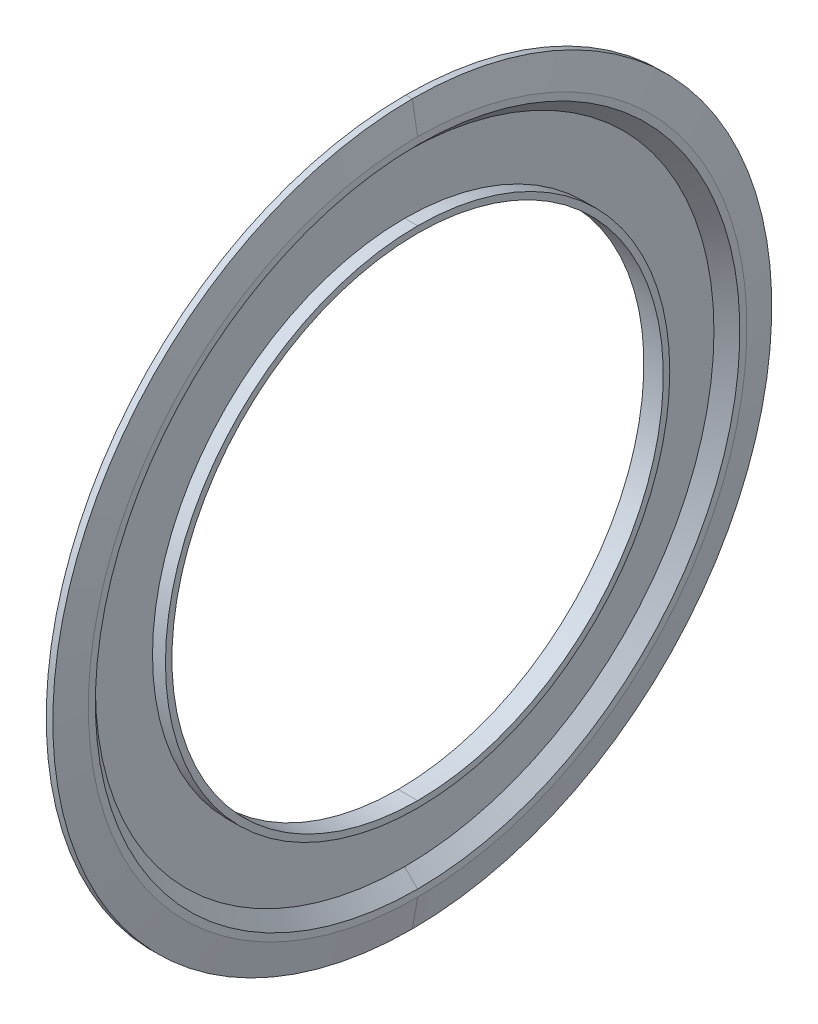
ISO-10303-21;
HEADER;
FILE_DESCRIPTION(('STEP AP214'),'2;1');
FILE_NAME('part.step','',(''),(''),'','','');
FILE_SCHEMA(('AUTOMOTIVE_DESIGN { 1 0 10303 214 1 1 1 1 }'));
ENDSEC;
DATA;
#1=APPLICATION_CONTEXT('core data for automotive mechanical design processes');
#2=APPLICATION_PROTOCOL_DEFINITION('international standard','automotive_design',2000,#1);
#3=PRODUCT_CONTEXT('',#1,'mechanical');
#4=PRODUCT('Part','Part','',(#3));
#5=PRODUCT_RELATED_PRODUCT_CATEGORY('part','',(#4));
#6=PRODUCT_DEFINITION_FORMATION('','',#4);
#7=PRODUCT_DEFINITION_CONTEXT('part definition',#1,'design');
#8=PRODUCT_DEFINITION('design','',#6,#7);
#9=PRODUCT_DEFINITION_SHAPE('','',#8);
#10=(LENGTH_UNIT() NAMED_UNIT(*) SI_UNIT(.MILLI.,.METRE.));
#11=(NAMED_UNIT(*) PLANE_ANGLE_UNIT() SI_UNIT($,.RADIAN.));
#12=(NAMED_UNIT(*) SI_UNIT($,.STERADIAN.) SOLID_ANGLE_UNIT());
#13=UNCERTAINTY_MEASURE_WITH_UNIT(LENGTH_MEASURE(1.E-05),#10,'distance_accuracy_value','');
#14=(GEOMETRIC_REPRESENTATION_CONTEXT(3) GLOBAL_UNCERTAINTY_ASSIGNED_CONTEXT((#13)) GLOBAL_UNIT_ASSIGNED_CONTEXT((#10,
#11,#12)) REPRESENTATION_CONTEXT('',''));
#15=CARTESIAN_POINT('',(0.,0.,0.));
#16=DIRECTION('',(0.,0.,1.));
#17=DIRECTION('',(1.,0.,0.));
#18=AXIS2_PLACEMENT_3D('',#15,#16,#17);
#19=CARTESIAN_POINT('',(0.891972615026867,11.476,0.));
#20=DIRECTION('',(1.,0.,0.));
#21=DIRECTION('',(0.,0.,1.));
#22=AXIS2_PLACEMENT_3D('',#19,#20,#21);
#23=PLANE('',#22);
#24=CARTESIAN_POINT('',(0.891972615026867,0.,0.));
#25=DIRECTION('',(-1.,0.,0.));
#26=DIRECTION('',(0.,1.,0.));
#27=AXIS2_PLACEMENT_3D('',#24,#25,#26);
#28=CIRCLE('',#27,11.352);
#29=CARTESIAN_POINT('',(0.891972615026867,11.352,0.));
#30=VERTEX_POINT('',#29);
#31=CARTESIAN_POINT('',(0.891972615026867,-11.352,0.));
#32=VERTEX_POINT('',#31);
#33=EDGE_CURVE('E11',#30,#32,#28,.T.);
#34=ORIENTED_EDGE('',*,*,#33,.T.);
#35=CARTESIAN_POINT('',(0.891972615026867,0.,0.));
#36=DIRECTION('',(-1.,0.,0.));
#37=DIRECTION('',(0.,1.,0.));
#38=AXIS2_PLACEMENT_3D('',#35,#36,#37);
#39=CIRCLE('',#38,11.352);
#40=EDGE_CURVE('E109',#32,#30,#39,.T.);
#41=ORIENTED_EDGE('',*,*,#40,.T.);
#42=EDGE_LOOP('',(#34,#41));
#43=FACE_BOUND('',#42,.T.);
#44=CARTESIAN_POINT('',(0.891972615026867,0.,0.));
#45=DIRECTION('',(-1.,0.,0.));
#46=DIRECTION('',(0.,1.,0.));
#47=AXIS2_PLACEMENT_3D('',#44,#45,#46);
#48=CIRCLE('',#47,11.6);
#49=CARTESIAN_POINT('',(0.891972615026867,11.6,0.));
#50=VERTEX_POINT('',#49);
#51=CARTESIAN_POINT('',(0.891972615026867,-11.6,0.));
#52=VERTEX_POINT('',#51);
#53=EDGE_CURVE('E183',#50,#52,#48,.T.);
#54=ORIENTED_EDGE('',*,*,#53,.F.);
#55=CARTESIAN_POINT('',(0.891972615026867,0.,0.));
#56=DIRECTION('',(-1.,0.,0.));
#57=DIRECTION('',(0.,1.,0.));
#58=AXIS2_PLACEMENT_3D('',#55,#56,#57);
#59=CIRCLE('',#58,11.6);
#60=EDGE_CURVE('E29',#52,#50,#59,.T.);
#61=ORIENTED_EDGE('',*,*,#60,.F.);
#62=EDGE_LOOP('',(#54,#61));
#63=FACE_BOUND('',#62,.T.);
#64=ADVANCED_FACE('F16',(#43,#63),#23,.T.);
#65=CARTESIAN_POINT('',(0.663972615026867,0.,0.));
#66=DIRECTION('',(1.,0.,0.));
#67=DIRECTION('',(0.,1.,0.));
#68=AXIS2_PLACEMENT_3D('',#65,#66,#67);
#69=CONICAL_SURFACE('',#68,11.124,0.785398163397447);
#70=DIRECTION('',(-0.707106781186549,-0.707106781186546,0.));
#71=VECTOR('',#70,1.);
#72=CARTESIAN_POINT('',(0.663972615026867,11.124,0.));
#73=LINE('',#72,#71);
#74=CARTESIAN_POINT('',(0.435972615026867,10.896,0.));
#75=VERTEX_POINT('',#74);
#76=EDGE_CURVE('E104',#30,#75,#73,.T.);
#77=ORIENTED_EDGE('',*,*,#76,.T.);
#78=CARTESIAN_POINT('',(0.435972615026867,0.,0.));
#79=DIRECTION('',(-1.,0.,0.));
#80=DIRECTION('',(0.,1.,0.));
#81=AXIS2_PLACEMENT_3D('',#78,#79,#80);
#82=CIRCLE('',#81,10.896);
#83=CARTESIAN_POINT('',(0.435972615026867,-10.896,0.));
#84=VERTEX_POINT('',#83);
#85=EDGE_CURVE('E23',#75,#84,#82,.T.);
#86=ORIENTED_EDGE('',*,*,#85,.T.);
#87=DIRECTION('',(0.707106781186549,-0.707106781186546,0.));
#88=VECTOR('',#87,1.);
#89=CARTESIAN_POINT('',(0.663972615026867,-11.124,0.));
#90=LINE('',#89,#88);
#91=EDGE_CURVE('E106',#84,#32,#90,.T.);
#92=ORIENTED_EDGE('',*,*,#91,.T.);
#93=ORIENTED_EDGE('',*,*,#33,.F.);
#94=EDGE_LOOP('',(#77,#86,#92,#93));
#95=FACE_BOUND('',#94,.T.);
#96=ADVANCED_FACE('F102',(#95),#69,.F.);
#97=CARTESIAN_POINT('',(0.435972615026867,9.8895,0.));
#98=DIRECTION('',(1.,0.,0.));
#99=DIRECTION('',(0.,-1.,0.));
#100=AXIS2_PLACEMENT_3D('',#97,#98,#99);
#101=PLANE('',#100);
#102=CARTESIAN_POINT('',(0.435972615026867,0.,0.));
#103=DIRECTION('',(-1.,0.,0.));
#104=DIRECTION('',(0.,1.,0.));
#105=AXIS2_PLACEMENT_3D('',#102,#103,#104);
#106=CIRCLE('',#105,8.883);
#107=CARTESIAN_POINT('',(0.435972615026867,8.883,0.));
#108=VERTEX_POINT('',#107);
#109=CARTESIAN_POINT('',(0.435972615026867,-8.883,0.));
#110=VERTEX_POINT('',#109);
#111=EDGE_CURVE('E144',#108,#110,#106,.T.);
#112=ORIENTED_EDGE('',*,*,#111,.T.);
#113=CARTESIAN_POINT('',(0.435972615026867,0.,0.));
#114=DIRECTION('',(-1.,0.,0.));
#115=DIRECTION('',(0.,1.,0.));
#116=AXIS2_PLACEMENT_3D('',#113,#114,#115);
#117=CIRCLE('',#116,8.883);
#118=EDGE_CURVE('E201',#110,#108,#117,.T.);
#119=ORIENTED_EDGE('',*,*,#118,.T.);
#120=EDGE_LOOP('',(#112,#119));
#121=FACE_BOUND('',#120,.T.);
#122=ORIENTED_EDGE('',*,*,#85,.F.);
#123=CARTESIAN_POINT('',(0.435972615026867,0.,0.));
#124=DIRECTION('',(-1.,0.,0.));
#125=DIRECTION('',(0.,1.,0.));
#126=AXIS2_PLACEMENT_3D('',#123,#124,#125);
#127=CIRCLE('',#126,10.896);
#128=EDGE_CURVE('E115',#84,#75,#127,.T.);
#129=ORIENTED_EDGE('',*,*,#128,.F.);
#130=EDGE_LOOP('',(#122,#129));
#131=FACE_BOUND('',#130,.T.);
#132=ADVANCED_FACE('F203',(#121,#131),#101,.T.);
#133=CARTESIAN_POINT('',(0.663972615026867,0.,0.));
#134=DIRECTION('',(-1.,0.,0.));
#135=DIRECTION('',(0.,1.,0.));
#136=AXIS2_PLACEMENT_3D('',#133,#134,#135);
#137=CYLINDRICAL_SURFACE('',#136,8.883);
#138=DIRECTION('',(-1.,0.,0.));
#139=VECTOR('',#138,1.);
#140=CARTESIAN_POINT('',(0.663972615026867,8.883,0.));
#141=LINE('',#140,#139);
#142=CARTESIAN_POINT('',(0.891972615026867,8.883,0.));
#143=VERTEX_POINT('',#142);
#144=EDGE_CURVE('E130',#143,#108,#141,.T.);
#145=ORIENTED_EDGE('',*,*,#144,.T.);
#146=ORIENTED_EDGE('',*,*,#118,.F.);
#147=DIRECTION('',(1.,0.,0.));
#148=VECTOR('',#147,1.);
#149=CARTESIAN_POINT('',(0.663972615026867,-8.883,0.));
#150=LINE('',#149,#148);
#151=CARTESIAN_POINT('',(0.891972615026867,-8.883,0.));
#152=VERTEX_POINT('',#151);
#153=EDGE_CURVE('E136',#110,#152,#150,.T.);
#154=ORIENTED_EDGE('',*,*,#153,.T.);
#155=CARTESIAN_POINT('',(0.891972615026867,0.,0.));
#156=DIRECTION('',(-1.,0.,0.));
#157=DIRECTION('',(0.,1.,0.));
#158=AXIS2_PLACEMENT_3D('',#155,#156,#157);
#159=CIRCLE('',#158,8.883);
#160=EDGE_CURVE('E199',#152,#143,#159,.T.);
#161=ORIENTED_EDGE('',*,*,#160,.T.);
#162=EDGE_LOOP('',(#145,#146,#154,#161));
#163=FACE_BOUND('',#162,.T.);
#164=ADVANCED_FACE('F205',(#163),#137,.T.);
#165=CARTESIAN_POINT('',(0.891972615026867,8.769,0.));
#166=DIRECTION('',(1.,0.,0.));
#167=DIRECTION('',(0.,0.,1.));
#168=AXIS2_PLACEMENT_3D('',#165,#166,#167);
#169=PLANE('',#168);
#170=CARTESIAN_POINT('',(0.891972615026867,0.,0.));
#171=DIRECTION('',(-1.,0.,0.));
#172=DIRECTION('',(0.,1.,0.));
#173=AXIS2_PLACEMENT_3D('',#170,#171,#172);
#174=CIRCLE('',#173,8.655);
#175=CARTESIAN_POINT('',(0.891972615026867,8.655,0.));
#176=VERTEX_POINT('',#175);
#177=CARTESIAN_POINT('',(0.891972615026867,-8.655,0.));
#178=VERTEX_POINT('',#177);
#179=EDGE_CURVE('E197',#176,#178,#174,.T.);
#180=ORIENTED_EDGE('',*,*,#179,.T.);
#181=CARTESIAN_POINT('',(0.891972615026867,0.,0.));
#182=DIRECTION('',(-1.,0.,0.));
#183=DIRECTION('',(0.,1.,0.));
#184=AXIS2_PLACEMENT_3D('',#181,#182,#183);
#185=CIRCLE('',#184,8.655);
#186=EDGE_CURVE('E120',#178,#176,#185,.T.);
#187=ORIENTED_EDGE('',*,*,#186,.T.);
#188=EDGE_LOOP('',(#180,#187));
#189=FACE_BOUND('',#188,.T.);
#190=CARTESIAN_POINT('',(0.891972615026867,0.,0.));
#191=DIRECTION('',(-1.,0.,0.));
#192=DIRECTION('',(0.,1.,0.));
#193=AXIS2_PLACEMENT_3D('',#190,#191,#192);
#194=CIRCLE('',#193,8.883);
#195=EDGE_CURVE('E133',#143,#152,#194,.T.);
#196=ORIENTED_EDGE('',*,*,#195,.F.);
#197=ORIENTED_EDGE('',*,*,#160,.F.);
#198=EDGE_LOOP('',(#196,#197));
#199=FACE_BOUND('',#198,.T.);
#200=ADVANCED_FACE('F213',(#189,#199),#169,.T.);
#201=CARTESIAN_POINT('',(0.549972615026867,0.,0.));
#202=DIRECTION('',(-1.,0.,0.));
#203=DIRECTION('',(0.,1.,0.));
#204=AXIS2_PLACEMENT_3D('',#201,#202,#203);
#205=CYLINDRICAL_SURFACE('',#204,8.655);
#206=DIRECTION('',(-1.,0.,0.));
#207=VECTOR('',#206,1.);
#208=CARTESIAN_POINT('',(0.549972615026867,8.655,0.));
#209=LINE('',#208,#207);
#210=CARTESIAN_POINT('',(0.207972615026867,8.655,0.));
#211=VERTEX_POINT('',#210);
#212=EDGE_CURVE('E124',#176,#211,#209,.T.);
#213=ORIENTED_EDGE('',*,*,#212,.T.);
#214=CARTESIAN_POINT('',(0.207972615026867,0.,0.));
#215=DIRECTION('',(-1.,0.,0.));
#216=DIRECTION('',(0.,1.,0.));
#217=AXIS2_PLACEMENT_3D('',#214,#215,#216);
#218=CIRCLE('',#217,8.655);
#219=CARTESIAN_POINT('',(0.207972615026867,-8.655,0.));
#220=VERTEX_POINT('',#219);
#221=EDGE_CURVE('E195',#211,#220,#218,.T.);
#222=ORIENTED_EDGE('',*,*,#221,.T.);
#223=DIRECTION('',(1.,0.,0.));
#224=VECTOR('',#223,1.);
#225=CARTESIAN_POINT('',(0.549972615026867,-8.655,0.));
#226=LINE('',#225,#224);
#227=EDGE_CURVE('E123',#220,#178,#226,.T.);
#228=ORIENTED_EDGE('',*,*,#227,.T.);
#229=ORIENTED_EDGE('',*,*,#179,.F.);
#230=EDGE_LOOP('',(#213,#222,#228,#229));
#231=FACE_BOUND('',#230,.T.);
#232=ADVANCED_FACE('F247',(#231),#205,.F.);
#233=CARTESIAN_POINT('',(0.207972615026867,9.82272034611053,0.));
#234=DIRECTION('',(-1.,0.,0.));
#235=DIRECTION('',(0.,0.,1.));
#236=AXIS2_PLACEMENT_3D('',#233,#234,#235);
#237=PLANE('',#236);
#238=ORIENTED_EDGE('',*,*,#221,.F.);
#239=CARTESIAN_POINT('',(0.207972615026867,0.,0.));
#240=DIRECTION('',(-1.,0.,0.));
#241=DIRECTION('',(0.,1.,0.));
#242=AXIS2_PLACEMENT_3D('',#239,#240,#241);
#243=CIRCLE('',#242,8.655);
#244=EDGE_CURVE('E128',#220,#211,#243,.T.);
#245=ORIENTED_EDGE('',*,*,#244,.F.);
#246=EDGE_LOOP('',(#238,#245));
#247=FACE_BOUND('',#246,.T.);
#248=CARTESIAN_POINT('',(0.207972615026867,0.,0.));
#249=DIRECTION('',(-1.,0.,0.));
#250=DIRECTION('',(0.,1.,0.));
#251=AXIS2_PLACEMENT_3D('',#248,#249,#250);
#252=CIRCLE('',#251,10.9904406922211);
#253=CARTESIAN_POINT('',(0.207972615026867,10.9904406922211,0.));
#254=VERTEX_POINT('',#253);
#255=CARTESIAN_POINT('',(0.207972615026867,-10.9904406922211,0.));
#256=VERTEX_POINT('',#255);
#257=EDGE_CURVE('E147',#254,#256,#252,.T.);
#258=ORIENTED_EDGE('',*,*,#257,.T.);
#259=CARTESIAN_POINT('',(0.207972615026867,0.,0.));
#260=DIRECTION('',(-1.,0.,0.));
#261=DIRECTION('',(0.,1.,0.));
#262=AXIS2_PLACEMENT_3D('',#259,#260,#261);
#263=CIRCLE('',#262,10.9904406922211);
#264=EDGE_CURVE('E193',#256,#254,#263,.T.);
#265=ORIENTED_EDGE('',*,*,#264,.T.);
#266=EDGE_LOOP('',(#258,#265));
#267=FACE_BOUND('',#266,.T.);
#268=ADVANCED_FACE('F257',(#247,#267),#237,.T.);
#269=CARTESIAN_POINT('',(0.435972615026867,0.,0.));
#270=DIRECTION('',(1.,0.,0.));
#271=DIRECTION('',(0.,1.,0.));
#272=AXIS2_PLACEMENT_3D('',#269,#270,#271);
#273=CONICAL_SURFACE('',#272,11.2184406922211,0.78539816339745);
#274=DIRECTION('',(-0.707106781186546,-0.707106781186549,0.));
#275=VECTOR('',#274,1.);
#276=CARTESIAN_POINT('',(0.435972615026867,11.2184406922211,0.));
#277=LINE('',#276,#275);
#278=CARTESIAN_POINT('',(0.663972615026867,11.4464406922211,0.));
#279=VERTEX_POINT('',#278);
#280=EDGE_CURVE('E141',#279,#254,#277,.T.);
#281=ORIENTED_EDGE('',*,*,#280,.T.);
#282=ORIENTED_EDGE('',*,*,#264,.F.);
#283=DIRECTION('',(0.707106781186546,-0.707106781186549,0.));
#284=VECTOR('',#283,1.);
#285=CARTESIAN_POINT('',(0.435972615026867,-11.2184406922211,0.));
#286=LINE('',#285,#284);
#287=CARTESIAN_POINT('',(0.663972615026867,-11.4464406922211,0.));
#288=VERTEX_POINT('',#287);
#289=EDGE_CURVE('E140',#256,#288,#286,.T.);
#290=ORIENTED_EDGE('',*,*,#289,.T.);
#291=CARTESIAN_POINT('',(0.663972615026867,0.,0.));
#292=DIRECTION('',(-1.,0.,0.));
#293=DIRECTION('',(0.,1.,0.));
#294=AXIS2_PLACEMENT_3D('',#291,#292,#293);
#295=CIRCLE('',#294,11.4464406922211);
#296=EDGE_CURVE('E118',#288,#279,#295,.T.);
#297=ORIENTED_EDGE('',*,*,#296,.T.);
#298=EDGE_LOOP('',(#281,#282,#290,#297));
#299=FACE_BOUND('',#298,.T.);
#300=ADVANCED_FACE('F267',(#299),#273,.T.);
#301=CARTESIAN_POINT('',(0.663972615026867,11.5132466384686,0.));
#302=DIRECTION('',(-1.,0.,0.));
#303=DIRECTION('',(0.,0.,1.));
#304=AXIS2_PLACEMENT_3D('',#301,#302,#303);
#305=PLANE('',#304);
#306=CARTESIAN_POINT('',(0.663972615026867,0.,0.));
#307=DIRECTION('',(-1.,0.,0.));
#308=DIRECTION('',(0.,1.,0.));
#309=AXIS2_PLACEMENT_3D('',#306,#307,#308);
#310=CIRCLE('',#309,11.4464406922211);
#311=EDGE_CURVE('E137',#279,#288,#310,.T.);
#312=ORIENTED_EDGE('',*,*,#311,.F.);
#313=ORIENTED_EDGE('',*,*,#296,.F.);
#314=EDGE_LOOP('',(#312,#313));
#315=FACE_BOUND('',#314,.T.);
#316=CARTESIAN_POINT('',(0.663972615026867,0.,0.));
#317=DIRECTION('',(-1.,0.,0.));
#318=DIRECTION('',(0.,1.,0.));
#319=AXIS2_PLACEMENT_3D('',#316,#317,#318);
#320=CIRCLE('',#319,11.5800525847161);
#321=CARTESIAN_POINT('',(0.663972615026867,11.5800525847161,0.));
#322=VERTEX_POINT('',#321);
#323=CARTESIAN_POINT('',(0.663972615026867,-11.5800525847161,0.));
#324=VERTEX_POINT('',#323);
#325=EDGE_CURVE('E191',#322,#324,#320,.T.);
#326=ORIENTED_EDGE('',*,*,#325,.T.);
#327=CARTESIAN_POINT('',(0.663972615026867,0.,0.));
#328=DIRECTION('',(-1.,0.,0.));
#329=DIRECTION('',(0.,1.,0.));
#330=AXIS2_PLACEMENT_3D('',#327,#328,#329);
#331=CIRCLE('',#330,11.5800525847161);
#332=EDGE_CURVE('E161',#324,#322,#331,.T.);
#333=ORIENTED_EDGE('',*,*,#332,.T.);
#334=EDGE_LOOP('',(#326,#333));
#335=FACE_BOUND('',#334,.T.);
#336=ADVANCED_FACE('F277',(#315,#335),#305,.T.);
#337=CARTESIAN_POINT('',(0.568408027534988,0.,0.));
#338=DIRECTION('',(-1.,0.,0.));
#339=DIRECTION('',(0.,1.,0.));
#340=AXIS2_PLACEMENT_3D('',#337,#338,#339);
#341=CONICAL_SURFACE('',#340,12.122026292358,1.39626340159546);
#342=DIRECTION('',(-0.17364817766693,0.984807753012208,0.));
#343=VECTOR('',#342,1.);
#344=CARTESIAN_POINT('',(0.568408027534988,12.122026292358,0.));
#345=LINE('',#344,#343);
#346=CARTESIAN_POINT('',(0.47284344004311,12.664,0.));
#347=VERTEX_POINT('',#346);
#348=EDGE_CURVE('E158',#322,#347,#345,.T.);
#349=ORIENTED_EDGE('',*,*,#348,.T.);
#350=CARTESIAN_POINT('',(0.47284344004311,0.,0.));
#351=DIRECTION('',(-1.,0.,0.));
#352=DIRECTION('',(0.,1.,0.));
#353=AXIS2_PLACEMENT_3D('',#350,#351,#352);
#354=CIRCLE('',#353,12.664);
#355=CARTESIAN_POINT('',(0.47284344004311,-12.664,0.));
#356=VERTEX_POINT('',#355);
#357=EDGE_CURVE('E179',#347,#356,#354,.T.);
#358=ORIENTED_EDGE('',*,*,#357,.T.);
#359=DIRECTION('',(0.17364817766693,0.984807753012208,0.));
#360=VECTOR('',#359,1.);
#361=CARTESIAN_POINT('',(0.568408027534988,-12.122026292358,0.));
#362=LINE('',#361,#360);
#363=EDGE_CURVE('E164',#356,#324,#362,.T.);
#364=ORIENTED_EDGE('',*,*,#363,.T.);
#365=ORIENTED_EDGE('',*,*,#325,.F.);
#366=EDGE_LOOP('',(#349,#358,#364,#365));
#367=FACE_BOUND('',#366,.T.);
#368=ADVANCED_FACE('F287',(#367),#341,.F.);
#369=CARTESIAN_POINT('',(0.588602073798085,0.,0.));
#370=DIRECTION('',(-1.,0.,0.));
#371=DIRECTION('',(0.,1.,0.));
#372=AXIS2_PLACEMENT_3D('',#369,#370,#371);
#373=CYLINDRICAL_SURFACE('',#372,12.664);
#374=DIRECTION('',(-1.,0.,0.));
#375=VECTOR('',#374,1.);
#376=CARTESIAN_POINT('',(0.588602073798085,12.664,0.));
#377=LINE('',#376,#375);
#378=CARTESIAN_POINT('',(0.70436070755306,12.664,0.));
#379=VERTEX_POINT('',#378);
#380=EDGE_CURVE('E170',#379,#347,#377,.T.);
#381=ORIENTED_EDGE('',*,*,#380,.T.);
#382=CARTESIAN_POINT('',(0.47284344004311,0.,0.));
#383=DIRECTION('',(-1.,0.,0.));
#384=DIRECTION('',(0.,1.,0.));
#385=AXIS2_PLACEMENT_3D('',#382,#383,#384);
#386=CIRCLE('',#385,12.664);
#387=EDGE_CURVE('E167',#356,#347,#386,.T.);
#388=ORIENTED_EDGE('',*,*,#387,.F.);
#389=DIRECTION('',(1.,0.,0.));
#390=VECTOR('',#389,1.);
#391=CARTESIAN_POINT('',(0.588602073798085,-12.664,0.));
#392=LINE('',#391,#390);
#393=CARTESIAN_POINT('',(0.70436070755306,-12.664,0.));
#394=VERTEX_POINT('',#393);
#395=EDGE_CURVE('E176',#356,#394,#392,.T.);
#396=ORIENTED_EDGE('',*,*,#395,.T.);
#397=CARTESIAN_POINT('',(0.70436070755306,0.,0.));
#398=DIRECTION('',(-1.,0.,0.));
#399=DIRECTION('',(0.,1.,0.));
#400=AXIS2_PLACEMENT_3D('',#397,#398,#399);
#401=CIRCLE('',#400,12.664);
#402=EDGE_CURVE('E188',#394,#379,#401,.T.);
#403=ORIENTED_EDGE('',*,*,#402,.T.);
#404=EDGE_LOOP('',(#381,#388,#396,#403));
#405=FACE_BOUND('',#404,.T.);
#406=ADVANCED_FACE('F297',(#405),#373,.T.);
#407=CARTESIAN_POINT('',(0.798166661289963,0.,0.));
#408=DIRECTION('',(-1.,0.,0.));
#409=DIRECTION('',(0.,1.,0.));
#410=AXIS2_PLACEMENT_3D('',#407,#408,#409);
#411=CONICAL_SURFACE('',#410,12.132,1.39626340159546);
#412=DIRECTION('',(-0.173648177666931,0.984807753012208,0.));
#413=VECTOR('',#412,1.);
#414=CARTESIAN_POINT('',(0.798166661289963,12.132,0.));
#415=LINE('',#414,#413);
#416=EDGE_CURVE('E181',#50,#379,#415,.T.);
#417=ORIENTED_EDGE('',*,*,#416,.T.);
#418=ORIENTED_EDGE('',*,*,#402,.F.);
#419=DIRECTION('',(0.173648177666931,0.984807753012208,0.));
#420=VECTOR('',#419,1.);
#421=CARTESIAN_POINT('',(0.798166661289963,-12.132,0.));
#422=LINE('',#421,#420);
#423=EDGE_CURVE('E186',#394,#52,#422,.T.);
#424=ORIENTED_EDGE('',*,*,#423,.T.);
#425=ORIENTED_EDGE('',*,*,#60,.T.);
#426=EDGE_LOOP('',(#417,#418,#424,#425));
#427=FACE_BOUND('',#426,.T.);
#428=ADVANCED_FACE('F307',(#427),#411,.T.);
#429=CARTESIAN_POINT('',(0.798166661289963,0.,0.));
#430=DIRECTION('',(-1.,0.,0.));
#431=DIRECTION('',(0.,1.,0.));
#432=AXIS2_PLACEMENT_3D('',#429,#430,#431);
#433=CONICAL_SURFACE('',#432,12.132,1.39626340159546);
#434=ORIENTED_EDGE('',*,*,#416,.F.);
#435=ORIENTED_EDGE('',*,*,#53,.T.);
#436=ORIENTED_EDGE('',*,*,#423,.F.);
#437=CARTESIAN_POINT('',(0.70436070755306,0.,0.));
#438=DIRECTION('',(-1.,0.,0.));
#439=DIRECTION('',(0.,1.,0.));
#440=AXIS2_PLACEMENT_3D('',#437,#438,#439);
#441=CIRCLE('',#440,12.664);
#442=EDGE_CURVE('E173',#379,#394,#441,.T.);
#443=ORIENTED_EDGE('',*,*,#442,.F.);
#444=EDGE_LOOP('',(#434,#435,#436,#443));
#445=FACE_BOUND('',#444,.T.);
#446=ADVANCED_FACE('F317',(#445),#433,.T.);
#447=CARTESIAN_POINT('',(0.588602073798085,0.,0.));
#448=DIRECTION('',(-1.,0.,0.));
#449=DIRECTION('',(0.,1.,0.));
#450=AXIS2_PLACEMENT_3D('',#447,#448,#449);
#451=CYLINDRICAL_SURFACE('',#450,12.664);
#452=ORIENTED_EDGE('',*,*,#380,.F.);
#453=ORIENTED_EDGE('',*,*,#442,.T.);
#454=ORIENTED_EDGE('',*,*,#395,.F.);
#455=ORIENTED_EDGE('',*,*,#357,.F.);
#456=EDGE_LOOP('',(#452,#453,#454,#455));
#457=FACE_BOUND('',#456,.T.);
#458=ADVANCED_FACE('F326',(#457),#451,.T.);
#459=CARTESIAN_POINT('',(0.568408027534988,0.,0.));
#460=DIRECTION('',(-1.,0.,0.));
#461=DIRECTION('',(0.,1.,0.));
#462=AXIS2_PLACEMENT_3D('',#459,#460,#461);
#463=CONICAL_SURFACE('',#462,12.122026292358,1.39626340159546);
#464=ORIENTED_EDGE('',*,*,#348,.F.);
#465=ORIENTED_EDGE('',*,*,#332,.F.);
#466=ORIENTED_EDGE('',*,*,#363,.F.);
#467=ORIENTED_EDGE('',*,*,#387,.T.);
#468=EDGE_LOOP('',(#464,#465,#466,#467));
#469=FACE_BOUND('',#468,.T.);
#470=ADVANCED_FACE('F336',(#469),#463,.F.);
#471=CARTESIAN_POINT('',(0.435972615026867,0.,0.));
#472=DIRECTION('',(1.,0.,0.));
#473=DIRECTION('',(0.,1.,0.));
#474=AXIS2_PLACEMENT_3D('',#471,#472,#473);
#475=CONICAL_SURFACE('',#474,11.2184406922211,0.78539816339745);
#476=ORIENTED_EDGE('',*,*,#280,.F.);
#477=ORIENTED_EDGE('',*,*,#311,.T.);
#478=ORIENTED_EDGE('',*,*,#289,.F.);
#479=ORIENTED_EDGE('',*,*,#257,.F.);
#480=EDGE_LOOP('',(#476,#477,#478,#479));
#481=FACE_BOUND('',#480,.T.);
#482=ADVANCED_FACE('F346',(#481),#475,.T.);
#483=CARTESIAN_POINT('',(0.549972615026867,0.,0.));
#484=DIRECTION('',(-1.,0.,0.));
#485=DIRECTION('',(0.,1.,0.));
#486=AXIS2_PLACEMENT_3D('',#483,#484,#485);
#487=CYLINDRICAL_SURFACE('',#486,8.655);
#488=ORIENTED_EDGE('',*,*,#212,.F.);
#489=ORIENTED_EDGE('',*,*,#186,.F.);
#490=ORIENTED_EDGE('',*,*,#227,.F.);
#491=ORIENTED_EDGE('',*,*,#244,.T.);
#492=EDGE_LOOP('',(#488,#489,#490,#491));
#493=FACE_BOUND('',#492,.T.);
#494=ADVANCED_FACE('F356',(#493),#487,.F.);
#495=CARTESIAN_POINT('',(0.663972615026867,0.,0.));
#496=DIRECTION('',(-1.,0.,0.));
#497=DIRECTION('',(0.,1.,0.));
#498=AXIS2_PLACEMENT_3D('',#495,#496,#497);
#499=CYLINDRICAL_SURFACE('',#498,8.883);
#500=ORIENTED_EDGE('',*,*,#144,.F.);
#501=ORIENTED_EDGE('',*,*,#195,.T.);
#502=ORIENTED_EDGE('',*,*,#153,.F.);
#503=ORIENTED_EDGE('',*,*,#111,.F.);
#504=EDGE_LOOP('',(#500,#501,#502,#503));
#505=FACE_BOUND('',#504,.T.);
#506=ADVANCED_FACE('F366',(#505),#499,.T.);
#507=CARTESIAN_POINT('',(0.663972615026867,0.,0.));
#508=DIRECTION('',(1.,0.,0.));
#509=DIRECTION('',(0.,1.,0.));
#510=AXIS2_PLACEMENT_3D('',#507,#508,#509);
#511=CONICAL_SURFACE('',#510,11.124,0.785398163397447);
#512=ORIENTED_EDGE('',*,*,#76,.F.);
#513=ORIENTED_EDGE('',*,*,#40,.F.);
#514=ORIENTED_EDGE('',*,*,#91,.F.);
#515=ORIENTED_EDGE('',*,*,#128,.T.);
#516=EDGE_LOOP('',(#512,#513,#514,#515));
#517=FACE_BOUND('',#516,.T.);
#518=ADVANCED_FACE('F113',(#517),#511,.F.);
#519=CLOSED_SHELL('',(#64,#96,#132,#164,#200,#232,#268,#300,#336,#368,#406,#428,#446,#458,#470,
#482,#494,#506,#518));
#520=MANIFOLD_SOLID_BREP('B1',#519);
#521=ADVANCED_BREP_SHAPE_REPRESENTATION('',(#18,#520),#14);
#522=SHAPE_DEFINITION_REPRESENTATION(#9,#521);
ENDSEC;
END-ISO-10303-21;
